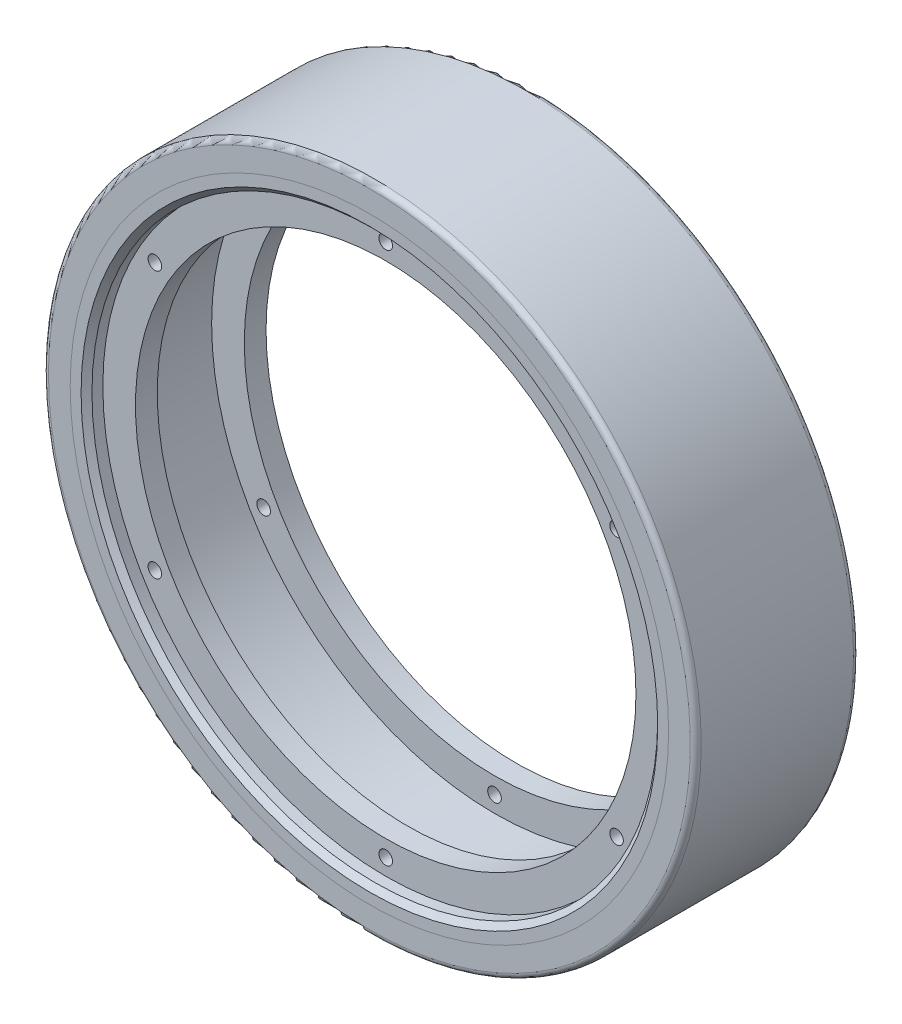
ISO-10303-21;
HEADER;
FILE_DESCRIPTION(('STEP AP214'),'2;1');
FILE_NAME('part.step','',(''),(''),'','','');
FILE_SCHEMA(('AUTOMOTIVE_DESIGN { 1 0 10303 214 1 1 1 1 }'));
ENDSEC;
DATA;
#1=APPLICATION_CONTEXT('core data for automotive mechanical design processes');
#2=APPLICATION_PROTOCOL_DEFINITION('international standard','automotive_design',2000,#1);
#3=PRODUCT_CONTEXT('',#1,'mechanical');
#4=PRODUCT('Part','Part','',(#3));
#5=PRODUCT_RELATED_PRODUCT_CATEGORY('part','',(#4));
#6=PRODUCT_DEFINITION_FORMATION('','',#4);
#7=PRODUCT_DEFINITION_CONTEXT('part definition',#1,'design');
#8=PRODUCT_DEFINITION('design','',#6,#7);
#9=PRODUCT_DEFINITION_SHAPE('','',#8);
#10=(LENGTH_UNIT() NAMED_UNIT(*) SI_UNIT(.MILLI.,.METRE.));
#11=(NAMED_UNIT(*) PLANE_ANGLE_UNIT() SI_UNIT($,.RADIAN.));
#12=(NAMED_UNIT(*) SI_UNIT($,.STERADIAN.) SOLID_ANGLE_UNIT());
#13=UNCERTAINTY_MEASURE_WITH_UNIT(LENGTH_MEASURE(1.E-05),#10,'distance_accuracy_value','');
#14=(GEOMETRIC_REPRESENTATION_CONTEXT(3) GLOBAL_UNCERTAINTY_ASSIGNED_CONTEXT((#13)) GLOBAL_UNIT_ASSIGNED_CONTEXT((#10,
#11,#12)) REPRESENTATION_CONTEXT('',''));
#15=CARTESIAN_POINT('',(0.,0.,0.));
#16=DIRECTION('',(0.,0.,1.));
#17=DIRECTION('',(1.,0.,0.));
#18=AXIS2_PLACEMENT_3D('',#15,#16,#17);
#19=CARTESIAN_POINT('',(0.,0.,15.));
#20=DIRECTION('',(0.,0.,-1.));
#21=DIRECTION('',(-1.,0.,0.));
#22=AXIS2_PLACEMENT_3D('',#19,#20,#21);
#23=CYLINDRICAL_SURFACE('',#22,60.);
#24=CARTESIAN_POINT('',(0.,0.,14.));
#25=DIRECTION('',(0.,0.,-1.));
#26=DIRECTION('',(-1.,0.,0.));
#27=AXIS2_PLACEMENT_3D('',#24,#25,#26);
#28=CIRCLE('',#27,60.);
#29=CARTESIAN_POINT('',(-60.,0.,14.));
#30=VERTEX_POINT('',#29);
#31=EDGE_CURVE('E57',#30,#30,#28,.T.);
#32=ORIENTED_EDGE('',*,*,#31,.T.);
#33=EDGE_LOOP('',(#32));
#34=FACE_BOUND('',#33,.T.);
#35=CARTESIAN_POINT('',(0.,0.,-14.));
#36=DIRECTION('',(0.,0.,-1.));
#37=DIRECTION('',(-1.,0.,0.));
#38=AXIS2_PLACEMENT_3D('',#35,#36,#37);
#39=CIRCLE('',#38,60.);
#40=CARTESIAN_POINT('',(-60.,0.,-14.));
#41=VERTEX_POINT('',#40);
#42=EDGE_CURVE('E61',#41,#41,#39,.F.);
#43=ORIENTED_EDGE('',*,*,#42,.T.);
#44=EDGE_LOOP('',(#43));
#45=FACE_BOUND('',#44,.T.);
#46=ADVANCED_FACE('F46',(#34,#45),#23,.T.);
#47=CARTESIAN_POINT('',(0.,0.,15.));
#48=DIRECTION('',(0.,0.,-1.));
#49=DIRECTION('',(-1.,0.,0.));
#50=AXIS2_PLACEMENT_3D('',#47,#48,#49);
#51=PLANE('',#50);
#52=CARTESIAN_POINT('',(0.,0.,15.));
#53=DIRECTION('',(0.,0.,-1.));
#54=DIRECTION('',(-1.,0.,0.));
#55=AXIS2_PLACEMENT_3D('',#52,#53,#54);
#56=CIRCLE('',#55,59.);
#57=CARTESIAN_POINT('',(-59.,0.,15.));
#58=VERTEX_POINT('',#57);
#59=EDGE_CURVE('E53',#58,#58,#56,.F.);
#60=ORIENTED_EDGE('',*,*,#59,.T.);
#61=EDGE_LOOP('',(#60));
#62=FACE_BOUND('',#61,.T.);
#63=CARTESIAN_POINT('',(0.,0.,15.));
#64=DIRECTION('',(0.,0.,-1.));
#65=DIRECTION('',(-1.,0.,0.));
#66=AXIS2_PLACEMENT_3D('',#63,#64,#65);
#67=CIRCLE('',#66,55.);
#68=CARTESIAN_POINT('',(-55.,0.,15.));
#69=VERTEX_POINT('',#68);
#70=EDGE_CURVE('E66',#69,#69,#67,.T.);
#71=ORIENTED_EDGE('',*,*,#70,.T.);
#72=EDGE_LOOP('',(#71));
#73=FACE_BOUND('',#72,.T.);
#74=ADVANCED_FACE('F73',(#62,#73),#51,.F.);
#75=CARTESIAN_POINT('',(0.,0.,-15.));
#76=DIRECTION('',(0.,0.,-1.));
#77=DIRECTION('',(-1.,0.,0.));
#78=AXIS2_PLACEMENT_3D('',#75,#76,#77);
#79=PLANE('',#78);
#80=CARTESIAN_POINT('',(0.,0.,-15.));
#81=DIRECTION('',(0.,0.,-1.));
#82=DIRECTION('',(-1.,0.,0.));
#83=AXIS2_PLACEMENT_3D('',#80,#81,#82);
#84=CIRCLE('',#83,59.);
#85=CARTESIAN_POINT('',(-59.,0.,-15.));
#86=VERTEX_POINT('',#85);
#87=EDGE_CURVE('E11',#86,#86,#84,.T.);
#88=ORIENTED_EDGE('',*,*,#87,.T.);
#89=EDGE_LOOP('',(#88));
#90=FACE_BOUND('',#89,.T.);
#91=CARTESIAN_POINT('',(0.,0.,-15.));
#92=DIRECTION('',(0.,0.,-1.));
#93=DIRECTION('',(-1.,0.,0.));
#94=AXIS2_PLACEMENT_3D('',#91,#92,#93);
#95=CIRCLE('',#94,55.);
#96=CARTESIAN_POINT('',(-55.,0.,-15.));
#97=VERTEX_POINT('',#96);
#98=EDGE_CURVE('E67',#97,#97,#95,.T.);
#99=ORIENTED_EDGE('',*,*,#98,.F.);
#100=EDGE_LOOP('',(#99));
#101=FACE_BOUND('',#100,.T.);
#102=ADVANCED_FACE('F79',(#90,#101),#79,.T.);
#103=CARTESIAN_POINT('',(0.,0.,15.));
#104=DIRECTION('',(0.,0.,-1.));
#105=DIRECTION('',(-1.,0.,0.));
#106=AXIS2_PLACEMENT_3D('',#103,#104,#105);
#107=CYLINDRICAL_SURFACE('',#106,55.);
#108=ORIENTED_EDGE('',*,*,#70,.F.);
#109=EDGE_LOOP('',(#108));
#110=FACE_BOUND('',#109,.T.);
#111=ORIENTED_EDGE('',*,*,#98,.T.);
#112=EDGE_LOOP('',(#111));
#113=FACE_BOUND('',#112,.T.);
#114=ADVANCED_FACE('F75',(#110,#113),#107,.F.);
#115=CARTESIAN_POINT('',(0.,0.,14.));
#116=DIRECTION('',(0.,0.,-1.));
#117=DIRECTION('',(-1.,0.,0.));
#118=AXIS2_PLACEMENT_3D('',#115,#116,#117);
#119=TOROIDAL_SURFACE('',#118,59.,1.);
#120=ORIENTED_EDGE('',*,*,#59,.F.);
#121=EDGE_LOOP('',(#120));
#122=FACE_BOUND('',#121,.T.);
#123=ORIENTED_EDGE('',*,*,#31,.F.);
#124=EDGE_LOOP('',(#123));
#125=FACE_BOUND('',#124,.T.);
#126=ADVANCED_FACE('F78',(#122,#125),#119,.T.);
#127=CARTESIAN_POINT('',(0.,0.,-14.));
#128=DIRECTION('',(0.,0.,-1.));
#129=DIRECTION('',(-1.,0.,0.));
#130=AXIS2_PLACEMENT_3D('',#127,#128,#129);
#131=TOROIDAL_SURFACE('',#130,59.,1.);
#132=ORIENTED_EDGE('',*,*,#42,.F.);
#133=EDGE_LOOP('',(#132));
#134=FACE_BOUND('',#133,.T.);
#135=ORIENTED_EDGE('',*,*,#87,.F.);
#136=EDGE_LOOP('',(#135));
#137=FACE_BOUND('',#136,.T.);
#138=ADVANCED_FACE('F48',(#134,#137),#131,.T.);
#139=CLOSED_SHELL('',(#46,#74,#102,#114,#126,#138));
#140=MANIFOLD_SOLID_BREP('B2',#139);
#141=CARTESIAN_POINT('',(0.,0.,182.));
#142=DIRECTION('',(0.,0.,-1.));
#143=DIRECTION('',(-1.,0.,0.));
#144=AXIS2_PLACEMENT_3D('',#141,#142,#143);
#145=CYLINDRICAL_SURFACE('',#144,46.);
#146=CARTESIAN_POINT('',(0.,0.,-12.));
#147=DIRECTION('',(0.,0.,-1.));
#148=DIRECTION('',(-1.,0.,0.));
#149=AXIS2_PLACEMENT_3D('',#146,#147,#148);
#150=CIRCLE('',#149,46.);
#151=CARTESIAN_POINT('',(-46.,0.,-12.));
#152=VERTEX_POINT('',#151);
#153=EDGE_CURVE('E192',#152,#152,#150,.T.);
#154=ORIENTED_EDGE('',*,*,#153,.T.);
#155=EDGE_LOOP('',(#154));
#156=FACE_BOUND('',#155,.T.);
#157=CARTESIAN_POINT('',(0.,0.,-8.00000000000001));
#158=DIRECTION('',(0.,0.,1.));
#159=DIRECTION('',(1.,0.,0.));
#160=AXIS2_PLACEMENT_3D('',#157,#158,#159);
#161=CIRCLE('',#160,46.);
#162=CARTESIAN_POINT('',(46.,0.,-8.00000000000001));
#163=VERTEX_POINT('',#162);
#164=EDGE_CURVE('E189',#163,#163,#161,.F.);
#165=ORIENTED_EDGE('',*,*,#164,.F.);
#166=EDGE_LOOP('',(#165));
#167=FACE_BOUND('',#166,.T.);
#168=ADVANCED_FACE('F137',(#156,#167),#145,.F.);
#169=CARTESIAN_POINT('',(0.,0.,15.));
#170=DIRECTION('',(0.,0.,-1.));
#171=DIRECTION('',(-1.,0.,0.));
#172=AXIS2_PLACEMENT_3D('',#169,#170,#171);
#173=CYLINDRICAL_SURFACE('',#172,55.);
#174=CARTESIAN_POINT('',(0.,0.,15.));
#175=DIRECTION('',(0.,0.,1.));
#176=DIRECTION('',(1.,0.,0.));
#177=AXIS2_PLACEMENT_3D('',#174,#175,#176);
#178=CIRCLE('',#177,55.);
#179=CARTESIAN_POINT('',(55.,0.,15.));
#180=VERTEX_POINT('',#179);
#181=EDGE_CURVE('E158',#180,#180,#178,.T.);
#182=ORIENTED_EDGE('',*,*,#181,.F.);
#183=EDGE_LOOP('',(#182));
#184=FACE_BOUND('',#183,.T.);
#185=CARTESIAN_POINT('',(0.,0.,-15.));
#186=DIRECTION('',(0.,0.,1.));
#187=DIRECTION('',(1.,0.,0.));
#188=AXIS2_PLACEMENT_3D('',#185,#186,#187);
#189=CIRCLE('',#188,55.);
#190=CARTESIAN_POINT('',(55.,0.,-15.));
#191=VERTEX_POINT('',#190);
#192=EDGE_CURVE('E201',#191,#191,#189,.T.);
#193=ORIENTED_EDGE('',*,*,#192,.T.);
#194=EDGE_LOOP('',(#193));
#195=FACE_BOUND('',#194,.T.);
#196=ADVANCED_FACE('F295',(#184,#195),#173,.T.);
#197=CARTESIAN_POINT('',(0.,0.,15.));
#198=DIRECTION('',(0.,0.,1.));
#199=DIRECTION('',(1.,0.,0.));
#200=AXIS2_PLACEMENT_3D('',#197,#198,#199);
#201=PLANE('',#200);
#202=CARTESIAN_POINT('',(0.,0.,15.));
#203=DIRECTION('',(0.,0.,1.));
#204=DIRECTION('',(1.,0.,0.));
#205=AXIS2_PLACEMENT_3D('',#202,#203,#204);
#206=CIRCLE('',#205,53.);
#207=CARTESIAN_POINT('',(53.,0.,15.));
#208=VERTEX_POINT('',#207);
#209=EDGE_CURVE('E45',#208,#208,#206,.F.);
#210=ORIENTED_EDGE('',*,*,#209,.T.);
#211=EDGE_LOOP('',(#210));
#212=FACE_BOUND('',#211,.T.);
#213=ORIENTED_EDGE('',*,*,#181,.T.);
#214=EDGE_LOOP('',(#213));
#215=FACE_BOUND('',#214,.T.);
#216=ADVANCED_FACE('F290',(#212,#215),#201,.T.);
#217=CARTESIAN_POINT('',(0.,0.,-15.));
#218=DIRECTION('',(0.,0.,1.));
#219=DIRECTION('',(1.,0.,0.));
#220=AXIS2_PLACEMENT_3D('',#217,#218,#219);
#221=PLANE('',#220);
#222=CARTESIAN_POINT('',(0.,0.,-15.));
#223=DIRECTION('',(0.,0.,1.));
#224=DIRECTION('',(1.,0.,0.));
#225=AXIS2_PLACEMENT_3D('',#222,#223,#224);
#226=CIRCLE('',#225,53.);
#227=CARTESIAN_POINT('',(53.,0.,-15.));
#228=VERTEX_POINT('',#227);
#229=EDGE_CURVE('E153',#228,#228,#226,.T.);
#230=ORIENTED_EDGE('',*,*,#229,.T.);
#231=EDGE_LOOP('',(#230));
#232=FACE_BOUND('',#231,.T.);
#233=ORIENTED_EDGE('',*,*,#192,.F.);
#234=EDGE_LOOP('',(#233));
#235=FACE_BOUND('',#234,.T.);
#236=ADVANCED_FACE('F285',(#232,#235),#221,.F.);
#237=CARTESIAN_POINT('',(0.,0.,12.));
#238=DIRECTION('',(0.,0.,1.));
#239=DIRECTION('',(1.,0.,0.));
#240=AXIS2_PLACEMENT_3D('',#237,#238,#239);
#241=CYLINDRICAL_SURFACE('',#240,52.);
#242=CARTESIAN_POINT('',(0.,0.,14.));
#243=DIRECTION('',(0.,0.,1.));
#244=DIRECTION('',(1.,0.,0.));
#245=AXIS2_PLACEMENT_3D('',#242,#243,#244);
#246=CIRCLE('',#245,52.);
#247=CARTESIAN_POINT('',(52.,0.,14.));
#248=VERTEX_POINT('',#247);
#249=EDGE_CURVE('E145',#248,#248,#246,.T.);
#250=ORIENTED_EDGE('',*,*,#249,.T.);
#251=EDGE_LOOP('',(#250));
#252=FACE_BOUND('',#251,.T.);
#253=CARTESIAN_POINT('',(0.,0.,12.));
#254=DIRECTION('',(0.,0.,1.));
#255=DIRECTION('',(1.,0.,0.));
#256=AXIS2_PLACEMENT_3D('',#253,#254,#255);
#257=CIRCLE('',#256,52.);
#258=CARTESIAN_POINT('',(52.,0.,12.));
#259=VERTEX_POINT('',#258);
#260=EDGE_CURVE('E204',#259,#259,#257,.T.);
#261=ORIENTED_EDGE('',*,*,#260,.F.);
#262=EDGE_LOOP('',(#261));
#263=FACE_BOUND('',#262,.T.);
#264=ADVANCED_FACE('F268',(#252,#263),#241,.F.);
#265=CARTESIAN_POINT('',(0.,0.,12.));
#266=DIRECTION('',(0.,0.,1.));
#267=DIRECTION('',(1.,0.,0.));
#268=AXIS2_PLACEMENT_3D('',#265,#266,#267);
#269=PLANE('',#268);
#270=CARTESIAN_POINT('',(42.4352447854372,24.5000000000005,12.));
#271=DIRECTION('',(0.,0.,1.));
#272=DIRECTION('',(1.,0.,0.));
#273=AXIS2_PLACEMENT_3D('',#270,#271,#272);
#274=CIRCLE('',#273,1.24999999999999);
#275=CARTESIAN_POINT('',(43.6852447854372,24.5000000000005,12.));
#276=VERTEX_POINT('',#275);
#277=EDGE_CURVE('E163',#276,#276,#274,.T.);
#278=ORIENTED_EDGE('',*,*,#277,.F.);
#279=EDGE_LOOP('',(#278));
#280=FACE_BOUND('',#279,.T.);
#281=CARTESIAN_POINT('',(42.4352447854377,-24.4999999999996,12.));
#282=DIRECTION('',(0.,0.,1.));
#283=DIRECTION('',(1.,0.,0.));
#284=AXIS2_PLACEMENT_3D('',#281,#282,#283);
#285=CIRCLE('',#284,1.25);
#286=CARTESIAN_POINT('',(43.6852447854377,-24.4999999999996,12.));
#287=VERTEX_POINT('',#286);
#288=EDGE_CURVE('E168',#287,#287,#285,.T.);
#289=ORIENTED_EDGE('',*,*,#288,.F.);
#290=EDGE_LOOP('',(#289));
#291=FACE_BOUND('',#290,.T.);
#292=CARTESIAN_POINT('',(0.,-49.,12.));
#293=DIRECTION('',(0.,0.,1.));
#294=DIRECTION('',(1.,0.,0.));
#295=AXIS2_PLACEMENT_3D('',#292,#293,#294);
#296=CIRCLE('',#295,1.25);
#297=CARTESIAN_POINT('',(1.25,-49.,12.));
#298=VERTEX_POINT('',#297);
#299=EDGE_CURVE('E173',#298,#298,#296,.T.);
#300=ORIENTED_EDGE('',*,*,#299,.F.);
#301=EDGE_LOOP('',(#300));
#302=FACE_BOUND('',#301,.T.);
#303=CARTESIAN_POINT('',(-42.4352447854374,-24.5000000000002,12.));
#304=DIRECTION('',(0.,0.,1.));
#305=DIRECTION('',(1.,0.,0.));
#306=AXIS2_PLACEMENT_3D('',#303,#304,#305);
#307=CIRCLE('',#306,1.25);
#308=CARTESIAN_POINT('',(-41.1852447854374,-24.5000000000002,12.));
#309=VERTEX_POINT('',#308);
#310=EDGE_CURVE('E178',#309,#309,#307,.T.);
#311=ORIENTED_EDGE('',*,*,#310,.F.);
#312=EDGE_LOOP('',(#311));
#313=FACE_BOUND('',#312,.T.);
#314=CARTESIAN_POINT('',(-42.4352447854376,24.4999999999999,12.));
#315=DIRECTION('',(0.,0.,1.));
#316=DIRECTION('',(1.,0.,0.));
#317=AXIS2_PLACEMENT_3D('',#314,#315,#316);
#318=CIRCLE('',#317,1.25);
#319=CARTESIAN_POINT('',(-41.1852447854376,24.4999999999999,12.));
#320=VERTEX_POINT('',#319);
#321=EDGE_CURVE('E183',#320,#320,#318,.T.);
#322=ORIENTED_EDGE('',*,*,#321,.F.);
#323=EDGE_LOOP('',(#322));
#324=FACE_BOUND('',#323,.T.);
#325=CARTESIAN_POINT('',(0.,49.,12.));
#326=DIRECTION('',(0.,0.,1.));
#327=DIRECTION('',(1.,0.,0.));
#328=AXIS2_PLACEMENT_3D('',#325,#326,#327);
#329=CIRCLE('',#328,1.25);
#330=CARTESIAN_POINT('',(1.25,49.,12.));
#331=VERTEX_POINT('',#330);
#332=EDGE_CURVE('E188',#331,#331,#329,.T.);
#333=ORIENTED_EDGE('',*,*,#332,.F.);
#334=EDGE_LOOP('',(#333));
#335=FACE_BOUND('',#334,.T.);
#336=CARTESIAN_POINT('',(0.,0.,12.));
#337=DIRECTION('',(0.,0.,1.));
#338=DIRECTION('',(1.,0.,0.));
#339=AXIS2_PLACEMENT_3D('',#336,#337,#338);
#340=CIRCLE('',#339,46.);
#341=CARTESIAN_POINT('',(46.,0.,12.));
#342=VERTEX_POINT('',#341);
#343=EDGE_CURVE('E197',#342,#342,#340,.T.);
#344=ORIENTED_EDGE('',*,*,#343,.F.);
#345=EDGE_LOOP('',(#344));
#346=FACE_BOUND('',#345,.T.);
#347=ORIENTED_EDGE('',*,*,#260,.T.);
#348=EDGE_LOOP('',(#347));
#349=FACE_BOUND('',#348,.T.);
#350=ADVANCED_FACE('F264',(#280,#291,#302,#313,#324,#335,#346,#349),#269,.T.);
#351=CARTESIAN_POINT('',(0.,0.,-12.));
#352=DIRECTION('',(0.,0.,-1.));
#353=DIRECTION('',(-1.,0.,0.));
#354=AXIS2_PLACEMENT_3D('',#351,#352,#353);
#355=CYLINDRICAL_SURFACE('',#354,52.);
#356=CARTESIAN_POINT('',(0.,0.,-14.));
#357=DIRECTION('',(0.,0.,1.));
#358=DIRECTION('',(1.,0.,0.));
#359=AXIS2_PLACEMENT_3D('',#356,#357,#358);
#360=CIRCLE('',#359,52.);
#361=CARTESIAN_POINT('',(52.,0.,-14.));
#362=VERTEX_POINT('',#361);
#363=EDGE_CURVE('E149',#362,#362,#360,.F.);
#364=ORIENTED_EDGE('',*,*,#363,.T.);
#365=EDGE_LOOP('',(#364));
#366=FACE_BOUND('',#365,.T.);
#367=CARTESIAN_POINT('',(0.,0.,-12.));
#368=DIRECTION('',(0.,0.,1.));
#369=DIRECTION('',(1.,0.,0.));
#370=AXIS2_PLACEMENT_3D('',#367,#368,#369);
#371=CIRCLE('',#370,52.);
#372=CARTESIAN_POINT('',(52.,0.,-12.));
#373=VERTEX_POINT('',#372);
#374=EDGE_CURVE('E200',#373,#373,#371,.T.);
#375=ORIENTED_EDGE('',*,*,#374,.T.);
#376=EDGE_LOOP('',(#375));
#377=FACE_BOUND('',#376,.T.);
#378=ADVANCED_FACE('F267',(#366,#377),#355,.F.);
#379=CARTESIAN_POINT('',(0.,0.,-12.));
#380=DIRECTION('',(0.,0.,-1.));
#381=DIRECTION('',(1.,0.,0.));
#382=AXIS2_PLACEMENT_3D('',#379,#380,#381);
#383=PLANE('',#382);
#384=CARTESIAN_POINT('',(42.4352447854372,24.5000000000005,-12.));
#385=DIRECTION('',(0.,0.,-1.));
#386=DIRECTION('',(-1.,0.,0.));
#387=AXIS2_PLACEMENT_3D('',#384,#385,#386);
#388=CIRCLE('',#387,1.24999999999999);
#389=CARTESIAN_POINT('',(41.1852447854372,24.5000000000005,-12.));
#390=VERTEX_POINT('',#389);
#391=EDGE_CURVE('E159',#390,#390,#388,.T.);
#392=ORIENTED_EDGE('',*,*,#391,.F.);
#393=EDGE_LOOP('',(#392));
#394=FACE_BOUND('',#393,.T.);
#395=CARTESIAN_POINT('',(42.4352447854377,-24.4999999999996,-12.));
#396=DIRECTION('',(0.,0.,-1.));
#397=DIRECTION('',(-1.,0.,0.));
#398=AXIS2_PLACEMENT_3D('',#395,#396,#397);
#399=CIRCLE('',#398,1.25);
#400=CARTESIAN_POINT('',(41.1852447854377,-24.4999999999996,-12.));
#401=VERTEX_POINT('',#400);
#402=EDGE_CURVE('E246',#401,#401,#399,.T.);
#403=ORIENTED_EDGE('',*,*,#402,.F.);
#404=EDGE_LOOP('',(#403));
#405=FACE_BOUND('',#404,.T.);
#406=CARTESIAN_POINT('',(0.,-49.,-12.));
#407=DIRECTION('',(0.,0.,-1.));
#408=DIRECTION('',(-1.,0.,0.));
#409=AXIS2_PLACEMENT_3D('',#406,#407,#408);
#410=CIRCLE('',#409,1.25);
#411=CARTESIAN_POINT('',(-1.25,-49.,-12.));
#412=VERTEX_POINT('',#411);
#413=EDGE_CURVE('E172',#412,#412,#410,.T.);
#414=ORIENTED_EDGE('',*,*,#413,.F.);
#415=EDGE_LOOP('',(#414));
#416=FACE_BOUND('',#415,.T.);
#417=CARTESIAN_POINT('',(-42.4352447854374,-24.5000000000002,-12.));
#418=DIRECTION('',(0.,0.,-1.));
#419=DIRECTION('',(-1.,0.,0.));
#420=AXIS2_PLACEMENT_3D('',#417,#418,#419);
#421=CIRCLE('',#420,1.25);
#422=CARTESIAN_POINT('',(-43.6852447854374,-24.5000000000002,-12.));
#423=VERTEX_POINT('',#422);
#424=EDGE_CURVE('E232',#423,#423,#421,.T.);
#425=ORIENTED_EDGE('',*,*,#424,.F.);
#426=EDGE_LOOP('',(#425));
#427=FACE_BOUND('',#426,.T.);
#428=CARTESIAN_POINT('',(-42.4352447854376,24.4999999999999,-12.));
#429=DIRECTION('',(0.,0.,-1.));
#430=DIRECTION('',(-1.,0.,0.));
#431=AXIS2_PLACEMENT_3D('',#428,#429,#430);
#432=CIRCLE('',#431,1.25);
#433=CARTESIAN_POINT('',(-43.6852447854376,24.4999999999999,-12.));
#434=VERTEX_POINT('',#433);
#435=EDGE_CURVE('E182',#434,#434,#432,.T.);
#436=ORIENTED_EDGE('',*,*,#435,.F.);
#437=EDGE_LOOP('',(#436));
#438=FACE_BOUND('',#437,.T.);
#439=CARTESIAN_POINT('',(0.,49.,-12.));
#440=DIRECTION('',(0.,0.,-1.));
#441=DIRECTION('',(-1.,0.,0.));
#442=AXIS2_PLACEMENT_3D('',#439,#440,#441);
#443=CIRCLE('',#442,1.25);
#444=CARTESIAN_POINT('',(-1.25,49.,-12.));
#445=VERTEX_POINT('',#444);
#446=EDGE_CURVE('E216',#445,#445,#443,.T.);
#447=ORIENTED_EDGE('',*,*,#446,.F.);
#448=EDGE_LOOP('',(#447));
#449=FACE_BOUND('',#448,.T.);
#450=ORIENTED_EDGE('',*,*,#153,.F.);
#451=EDGE_LOOP('',(#450));
#452=FACE_BOUND('',#451,.T.);
#453=ORIENTED_EDGE('',*,*,#374,.F.);
#454=EDGE_LOOP('',(#453));
#455=FACE_BOUND('',#454,.T.);
#456=ADVANCED_FACE('F309',(#394,#405,#416,#427,#438,#449,#452,#455),#383,.T.);
#457=CARTESIAN_POINT('',(0.,0.,8.00000000000001));
#458=DIRECTION('',(0.,0.,1.));
#459=DIRECTION('',(1.,0.,0.));
#460=AXIS2_PLACEMENT_3D('',#457,#458,#459);
#461=CIRCLE('',#460,46.);
#462=CARTESIAN_POINT('',(46.,0.,8.00000000000001));
#463=VERTEX_POINT('',#462);
#464=EDGE_CURVE('E193',#463,#463,#461,.F.);
#465=ORIENTED_EDGE('',*,*,#464,.T.);
#466=EDGE_LOOP('',(#465));
#467=FACE_BOUND('',#466,.T.);
#468=ORIENTED_EDGE('',*,*,#343,.T.);
#469=EDGE_LOOP('',(#468));
#470=FACE_BOUND('',#469,.T.);
#471=ADVANCED_FACE('F298',(#467,#470),#145,.F.);
#472=CARTESIAN_POINT('',(0.,0.,-8.));
#473=DIRECTION('',(0.,0.,1.));
#474=DIRECTION('',(1.,0.,0.));
#475=AXIS2_PLACEMENT_3D('',#472,#473,#474);
#476=PLANE('',#475);
#477=CARTESIAN_POINT('',(42.4352447854372,24.5000000000005,-8.));
#478=DIRECTION('',(0.,0.,1.));
#479=DIRECTION('',(1.,0.,0.));
#480=AXIS2_PLACEMENT_3D('',#477,#478,#479);
#481=CIRCLE('',#480,1.24999999999999);
#482=CARTESIAN_POINT('',(43.6852447854372,24.5000000000005,-8.));
#483=VERTEX_POINT('',#482);
#484=EDGE_CURVE('E253',#483,#483,#481,.T.);
#485=ORIENTED_EDGE('',*,*,#484,.F.);
#486=EDGE_LOOP('',(#485));
#487=FACE_BOUND('',#486,.T.);
#488=CARTESIAN_POINT('',(42.4352447854377,-24.4999999999996,-8.));
#489=DIRECTION('',(0.,0.,1.));
#490=DIRECTION('',(1.,0.,0.));
#491=AXIS2_PLACEMENT_3D('',#488,#489,#490);
#492=CIRCLE('',#491,1.25);
#493=CARTESIAN_POINT('',(43.6852447854377,-24.4999999999996,-8.));
#494=VERTEX_POINT('',#493);
#495=EDGE_CURVE('E167',#494,#494,#492,.T.);
#496=ORIENTED_EDGE('',*,*,#495,.F.);
#497=EDGE_LOOP('',(#496));
#498=FACE_BOUND('',#497,.T.);
#499=CARTESIAN_POINT('',(0.,-49.,-8.));
#500=DIRECTION('',(0.,0.,1.));
#501=DIRECTION('',(1.,0.,0.));
#502=AXIS2_PLACEMENT_3D('',#499,#500,#501);
#503=CIRCLE('',#502,1.25);
#504=CARTESIAN_POINT('',(1.25,-49.,-8.));
#505=VERTEX_POINT('',#504);
#506=EDGE_CURVE('E239',#505,#505,#503,.T.);
#507=ORIENTED_EDGE('',*,*,#506,.F.);
#508=EDGE_LOOP('',(#507));
#509=FACE_BOUND('',#508,.T.);
#510=CARTESIAN_POINT('',(-42.4352447854374,-24.5000000000002,-8.));
#511=DIRECTION('',(0.,0.,1.));
#512=DIRECTION('',(1.,0.,0.));
#513=AXIS2_PLACEMENT_3D('',#510,#511,#512);
#514=CIRCLE('',#513,1.25);
#515=CARTESIAN_POINT('',(-41.1852447854374,-24.5000000000002,-8.));
#516=VERTEX_POINT('',#515);
#517=EDGE_CURVE('E177',#516,#516,#514,.T.);
#518=ORIENTED_EDGE('',*,*,#517,.F.);
#519=EDGE_LOOP('',(#518));
#520=FACE_BOUND('',#519,.T.);
#521=CARTESIAN_POINT('',(-42.4352447854376,24.4999999999999,-8.));
#522=DIRECTION('',(0.,0.,1.));
#523=DIRECTION('',(1.,0.,0.));
#524=AXIS2_PLACEMENT_3D('',#521,#522,#523);
#525=CIRCLE('',#524,1.25);
#526=CARTESIAN_POINT('',(-41.1852447854376,24.4999999999999,-8.));
#527=VERTEX_POINT('',#526);
#528=EDGE_CURVE('E225',#527,#527,#525,.T.);
#529=ORIENTED_EDGE('',*,*,#528,.F.);
#530=EDGE_LOOP('',(#529));
#531=FACE_BOUND('',#530,.T.);
#532=CARTESIAN_POINT('',(0.,49.,-8.));
#533=DIRECTION('',(0.,0.,1.));
#534=DIRECTION('',(1.,0.,0.));
#535=AXIS2_PLACEMENT_3D('',#532,#533,#534);
#536=CIRCLE('',#535,1.25);
#537=CARTESIAN_POINT('',(1.25,49.,-8.));
#538=VERTEX_POINT('',#537);
#539=EDGE_CURVE('E187',#538,#538,#536,.T.);
#540=ORIENTED_EDGE('',*,*,#539,.F.);
#541=EDGE_LOOP('',(#540));
#542=FACE_BOUND('',#541,.T.);
#543=CARTESIAN_POINT('',(0.,0.,-8.));
#544=DIRECTION('',(0.,0.,1.));
#545=DIRECTION('',(1.,0.,0.));
#546=AXIS2_PLACEMENT_3D('',#543,#544,#545);
#547=CIRCLE('',#546,52.);
#548=CARTESIAN_POINT('',(52.,0.,-8.));
#549=VERTEX_POINT('',#548);
#550=EDGE_CURVE('E196',#549,#549,#547,.T.);
#551=ORIENTED_EDGE('',*,*,#550,.T.);
#552=EDGE_LOOP('',(#551));
#553=FACE_BOUND('',#552,.T.);
#554=ORIENTED_EDGE('',*,*,#164,.T.);
#555=EDGE_LOOP('',(#554));
#556=FACE_BOUND('',#555,.T.);
#557=ADVANCED_FACE('F308',(#487,#498,#509,#520,#531,#542,#553,#556),#476,.T.);
#558=CARTESIAN_POINT('',(0.,0.,8.));
#559=DIRECTION('',(0.,0.,1.));
#560=DIRECTION('',(1.,0.,0.));
#561=AXIS2_PLACEMENT_3D('',#558,#559,#560);
#562=PLANE('',#561);
#563=CARTESIAN_POINT('',(42.4352447854372,24.5000000000005,8.));
#564=DIRECTION('',(0.,0.,1.));
#565=DIRECTION('',(1.,0.,0.));
#566=AXIS2_PLACEMENT_3D('',#563,#564,#565);
#567=CIRCLE('',#566,1.24999999999999);
#568=CARTESIAN_POINT('',(43.6852447854372,24.5000000000005,8.));
#569=VERTEX_POINT('',#568);
#570=EDGE_CURVE('E162',#569,#569,#567,.T.);
#571=ORIENTED_EDGE('',*,*,#570,.T.);
#572=EDGE_LOOP('',(#571));
#573=FACE_BOUND('',#572,.T.);
#574=CARTESIAN_POINT('',(42.4352447854377,-24.4999999999996,8.));
#575=DIRECTION('',(0.,0.,1.));
#576=DIRECTION('',(1.,0.,0.));
#577=AXIS2_PLACEMENT_3D('',#574,#575,#576);
#578=CIRCLE('',#577,1.25);
#579=CARTESIAN_POINT('',(43.6852447854377,-24.4999999999996,8.));
#580=VERTEX_POINT('',#579);
#581=EDGE_CURVE('E164',#580,#580,#578,.T.);
#582=ORIENTED_EDGE('',*,*,#581,.T.);
#583=EDGE_LOOP('',(#582));
#584=FACE_BOUND('',#583,.T.);
#585=CARTESIAN_POINT('',(0.,-49.,8.));
#586=DIRECTION('',(0.,0.,1.));
#587=DIRECTION('',(1.,0.,0.));
#588=AXIS2_PLACEMENT_3D('',#585,#586,#587);
#589=CIRCLE('',#588,1.25);
#590=CARTESIAN_POINT('',(1.25,-49.,8.));
#591=VERTEX_POINT('',#590);
#592=EDGE_CURVE('E169',#591,#591,#589,.T.);
#593=ORIENTED_EDGE('',*,*,#592,.T.);
#594=EDGE_LOOP('',(#593));
#595=FACE_BOUND('',#594,.T.);
#596=CARTESIAN_POINT('',(-42.4352447854374,-24.5000000000002,8.));
#597=DIRECTION('',(0.,0.,1.));
#598=DIRECTION('',(1.,0.,0.));
#599=AXIS2_PLACEMENT_3D('',#596,#597,#598);
#600=CIRCLE('',#599,1.25);
#601=CARTESIAN_POINT('',(-41.1852447854374,-24.5000000000002,8.));
#602=VERTEX_POINT('',#601);
#603=EDGE_CURVE('E174',#602,#602,#600,.T.);
#604=ORIENTED_EDGE('',*,*,#603,.T.);
#605=EDGE_LOOP('',(#604));
#606=FACE_BOUND('',#605,.T.);
#607=CARTESIAN_POINT('',(-42.4352447854376,24.4999999999999,8.));
#608=DIRECTION('',(0.,0.,1.));
#609=DIRECTION('',(1.,0.,0.));
#610=AXIS2_PLACEMENT_3D('',#607,#608,#609);
#611=CIRCLE('',#610,1.25);
#612=CARTESIAN_POINT('',(-41.1852447854376,24.4999999999999,8.));
#613=VERTEX_POINT('',#612);
#614=EDGE_CURVE('E179',#613,#613,#611,.T.);
#615=ORIENTED_EDGE('',*,*,#614,.T.);
#616=EDGE_LOOP('',(#615));
#617=FACE_BOUND('',#616,.T.);
#618=CARTESIAN_POINT('',(0.,49.,8.));
#619=DIRECTION('',(0.,0.,1.));
#620=DIRECTION('',(1.,0.,0.));
#621=AXIS2_PLACEMENT_3D('',#618,#619,#620);
#622=CIRCLE('',#621,1.25);
#623=CARTESIAN_POINT('',(1.25,49.,8.));
#624=VERTEX_POINT('',#623);
#625=EDGE_CURVE('E184',#624,#624,#622,.T.);
#626=ORIENTED_EDGE('',*,*,#625,.T.);
#627=EDGE_LOOP('',(#626));
#628=FACE_BOUND('',#627,.T.);
#629=CARTESIAN_POINT('',(0.,0.,8.));
#630=DIRECTION('',(0.,0.,1.));
#631=DIRECTION('',(1.,0.,0.));
#632=AXIS2_PLACEMENT_3D('',#629,#630,#631);
#633=CIRCLE('',#632,52.);
#634=CARTESIAN_POINT('',(52.,0.,8.));
#635=VERTEX_POINT('',#634);
#636=EDGE_CURVE('E213',#635,#635,#633,.T.);
#637=ORIENTED_EDGE('',*,*,#636,.F.);
#638=EDGE_LOOP('',(#637));
#639=FACE_BOUND('',#638,.T.);
#640=ORIENTED_EDGE('',*,*,#464,.F.);
#641=EDGE_LOOP('',(#640));
#642=FACE_BOUND('',#641,.T.);
#643=ADVANCED_FACE('F315',(#573,#584,#595,#606,#617,#628,#639,#642),#562,.F.);
#644=CARTESIAN_POINT('',(0.,0.,-8.));
#645=DIRECTION('',(0.,0.,1.));
#646=DIRECTION('',(1.,0.,0.));
#647=AXIS2_PLACEMENT_3D('',#644,#645,#646);
#648=CYLINDRICAL_SURFACE('',#647,52.);
#649=ORIENTED_EDGE('',*,*,#550,.F.);
#650=EDGE_LOOP('',(#649));
#651=FACE_BOUND('',#650,.T.);
#652=ORIENTED_EDGE('',*,*,#636,.T.);
#653=EDGE_LOOP('',(#652));
#654=FACE_BOUND('',#653,.T.);
#655=ADVANCED_FACE('F323',(#651,#654),#648,.F.);
#656=CARTESIAN_POINT('',(0.,49.,12.));
#657=DIRECTION('',(0.,0.,1.));
#658=DIRECTION('',(1.,0.,0.));
#659=AXIS2_PLACEMENT_3D('',#656,#657,#658);
#660=CYLINDRICAL_SURFACE('',#659,1.25);
#661=ORIENTED_EDGE('',*,*,#332,.T.);
#662=EDGE_LOOP('',(#661));
#663=FACE_BOUND('',#662,.T.);
#664=ORIENTED_EDGE('',*,*,#625,.F.);
#665=EDGE_LOOP('',(#664));
#666=FACE_BOUND('',#665,.T.);
#667=ADVANCED_FACE('F329',(#663,#666),#660,.F.);
#668=ORIENTED_EDGE('',*,*,#446,.T.);
#669=EDGE_LOOP('',(#668));
#670=FACE_BOUND('',#669,.T.);
#671=ORIENTED_EDGE('',*,*,#539,.T.);
#672=EDGE_LOOP('',(#671));
#673=FACE_BOUND('',#672,.T.);
#674=ADVANCED_FACE('F333',(#670,#673),#660,.F.);
#675=CARTESIAN_POINT('',(-42.4352447854376,24.4999999999999,12.));
#676=DIRECTION('',(0.,0.,1.));
#677=DIRECTION('',(1.,0.,0.));
#678=AXIS2_PLACEMENT_3D('',#675,#676,#677);
#679=CYLINDRICAL_SURFACE('',#678,1.25);
#680=ORIENTED_EDGE('',*,*,#321,.T.);
#681=EDGE_LOOP('',(#680));
#682=FACE_BOUND('',#681,.T.);
#683=ORIENTED_EDGE('',*,*,#614,.F.);
#684=EDGE_LOOP('',(#683));
#685=FACE_BOUND('',#684,.T.);
#686=ADVANCED_FACE('F336',(#682,#685),#679,.F.);
#687=ORIENTED_EDGE('',*,*,#528,.T.);
#688=EDGE_LOOP('',(#687));
#689=FACE_BOUND('',#688,.T.);
#690=ORIENTED_EDGE('',*,*,#435,.T.);
#691=EDGE_LOOP('',(#690));
#692=FACE_BOUND('',#691,.T.);
#693=ADVANCED_FACE('F338',(#689,#692),#679,.F.);
#694=CARTESIAN_POINT('',(-42.4352447854374,-24.5000000000002,12.));
#695=DIRECTION('',(0.,0.,1.));
#696=DIRECTION('',(1.,0.,0.));
#697=AXIS2_PLACEMENT_3D('',#694,#695,#696);
#698=CYLINDRICAL_SURFACE('',#697,1.25);
#699=ORIENTED_EDGE('',*,*,#310,.T.);
#700=EDGE_LOOP('',(#699));
#701=FACE_BOUND('',#700,.T.);
#702=ORIENTED_EDGE('',*,*,#603,.F.);
#703=EDGE_LOOP('',(#702));
#704=FACE_BOUND('',#703,.T.);
#705=ADVANCED_FACE('F341',(#701,#704),#698,.F.);
#706=ORIENTED_EDGE('',*,*,#424,.T.);
#707=EDGE_LOOP('',(#706));
#708=FACE_BOUND('',#707,.T.);
#709=ORIENTED_EDGE('',*,*,#517,.T.);
#710=EDGE_LOOP('',(#709));
#711=FACE_BOUND('',#710,.T.);
#712=ADVANCED_FACE('F343',(#708,#711),#698,.F.);
#713=CARTESIAN_POINT('',(0.,-49.,12.));
#714=DIRECTION('',(0.,0.,1.));
#715=DIRECTION('',(1.,0.,0.));
#716=AXIS2_PLACEMENT_3D('',#713,#714,#715);
#717=CYLINDRICAL_SURFACE('',#716,1.25);
#718=ORIENTED_EDGE('',*,*,#299,.T.);
#719=EDGE_LOOP('',(#718));
#720=FACE_BOUND('',#719,.T.);
#721=ORIENTED_EDGE('',*,*,#592,.F.);
#722=EDGE_LOOP('',(#721));
#723=FACE_BOUND('',#722,.T.);
#724=ADVANCED_FACE('F346',(#720,#723),#717,.F.);
#725=ORIENTED_EDGE('',*,*,#506,.T.);
#726=EDGE_LOOP('',(#725));
#727=FACE_BOUND('',#726,.T.);
#728=ORIENTED_EDGE('',*,*,#413,.T.);
#729=EDGE_LOOP('',(#728));
#730=FACE_BOUND('',#729,.T.);
#731=ADVANCED_FACE('F348',(#727,#730),#717,.F.);
#732=CARTESIAN_POINT('',(42.4352447854377,-24.4999999999996,12.));
#733=DIRECTION('',(0.,0.,1.));
#734=DIRECTION('',(1.,0.,0.));
#735=AXIS2_PLACEMENT_3D('',#732,#733,#734);
#736=CYLINDRICAL_SURFACE('',#735,1.25);
#737=ORIENTED_EDGE('',*,*,#288,.T.);
#738=EDGE_LOOP('',(#737));
#739=FACE_BOUND('',#738,.T.);
#740=ORIENTED_EDGE('',*,*,#581,.F.);
#741=EDGE_LOOP('',(#740));
#742=FACE_BOUND('',#741,.T.);
#743=ADVANCED_FACE('F351',(#739,#742),#736,.F.);
#744=ORIENTED_EDGE('',*,*,#402,.T.);
#745=EDGE_LOOP('',(#744));
#746=FACE_BOUND('',#745,.T.);
#747=ORIENTED_EDGE('',*,*,#495,.T.);
#748=EDGE_LOOP('',(#747));
#749=FACE_BOUND('',#748,.T.);
#750=ADVANCED_FACE('F353',(#746,#749),#736,.F.);
#751=CARTESIAN_POINT('',(42.4352447854372,24.5000000000005,12.));
#752=DIRECTION('',(0.,0.,1.));
#753=DIRECTION('',(1.,0.,0.));
#754=AXIS2_PLACEMENT_3D('',#751,#752,#753);
#755=CYLINDRICAL_SURFACE('',#754,1.24999999999999);
#756=ORIENTED_EDGE('',*,*,#484,.T.);
#757=EDGE_LOOP('',(#756));
#758=FACE_BOUND('',#757,.T.);
#759=ORIENTED_EDGE('',*,*,#391,.T.);
#760=EDGE_LOOP('',(#759));
#761=FACE_BOUND('',#760,.T.);
#762=ADVANCED_FACE('F356',(#758,#761),#755,.F.);
#763=ORIENTED_EDGE('',*,*,#277,.T.);
#764=EDGE_LOOP('',(#763));
#765=FACE_BOUND('',#764,.T.);
#766=ORIENTED_EDGE('',*,*,#570,.F.);
#767=EDGE_LOOP('',(#766));
#768=FACE_BOUND('',#767,.T.);
#769=ADVANCED_FACE('F261',(#765,#768),#755,.F.);
#770=CARTESIAN_POINT('',(0.,0.,-15.));
#771=DIRECTION('',(0.,0.,-1.));
#772=DIRECTION('',(-1.,0.,0.));
#773=AXIS2_PLACEMENT_3D('',#770,#771,#772);
#774=CONICAL_SURFACE('',#773,53.,0.785398163397441);
#775=ORIENTED_EDGE('',*,*,#363,.F.);
#776=EDGE_LOOP('',(#775));
#777=FACE_BOUND('',#776,.T.);
#778=ORIENTED_EDGE('',*,*,#229,.F.);
#779=EDGE_LOOP('',(#778));
#780=FACE_BOUND('',#779,.T.);
#781=ADVANCED_FACE('F363',(#777,#780),#774,.F.);
#782=CARTESIAN_POINT('',(0.,0.,14.));
#783=DIRECTION('',(0.,0.,1.));
#784=DIRECTION('',(1.,0.,0.));
#785=AXIS2_PLACEMENT_3D('',#782,#783,#784);
#786=CONICAL_SURFACE('',#785,52.,0.785398163397445);
#787=ORIENTED_EDGE('',*,*,#209,.F.);
#788=EDGE_LOOP('',(#787));
#789=FACE_BOUND('',#788,.T.);
#790=ORIENTED_EDGE('',*,*,#249,.F.);
#791=EDGE_LOOP('',(#790));
#792=FACE_BOUND('',#791,.T.);
#793=ADVANCED_FACE('F140',(#789,#792),#786,.F.);
#794=CLOSED_SHELL('',(#168,#196,#216,#236,#264,#350,#378,#456,#471,#557,#643,#655,#667,#674,
#686,#693,#705,#712,#724,#731,#743,#750,#762,#769,#781,#793));
#795=MANIFOLD_SOLID_BREP('B6',#794);
#796=ADVANCED_BREP_SHAPE_REPRESENTATION('',(#18,#140,#795),#14);
#797=SHAPE_DEFINITION_REPRESENTATION(#9,#796);
ENDSEC;
END-ISO-10303-21;
